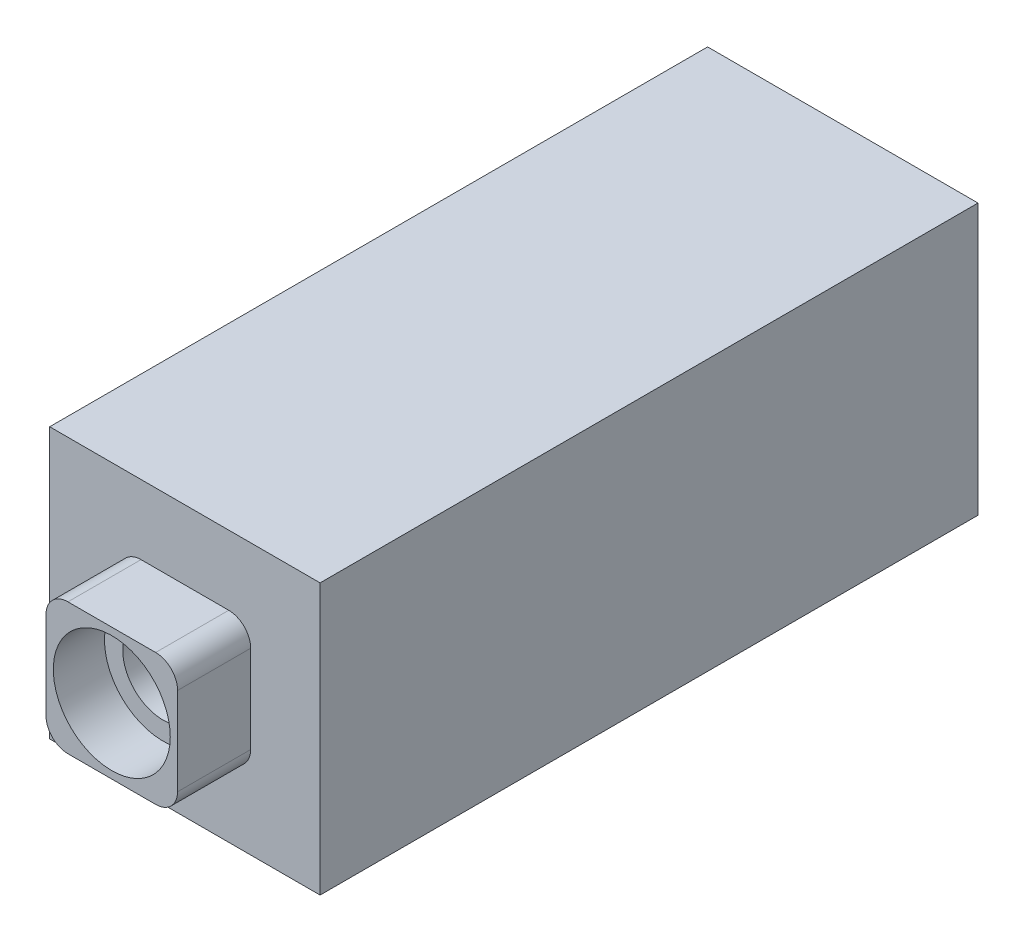
ISO-10303-21;
HEADER;
FILE_DESCRIPTION(('STEP AP214'),'2;1');
FILE_NAME('part.step','',(''),(''),'','','');
FILE_SCHEMA(('AUTOMOTIVE_DESIGN { 1 0 10303 214 1 1 1 1 }'));
ENDSEC;
DATA;
#1=APPLICATION_CONTEXT('core data for automotive mechanical design processes');
#2=APPLICATION_PROTOCOL_DEFINITION('international standard','automotive_design',2000,#1);
#3=PRODUCT_CONTEXT('',#1,'mechanical');
#4=PRODUCT('Part','Part','',(#3));
#5=PRODUCT_RELATED_PRODUCT_CATEGORY('part','',(#4));
#6=PRODUCT_DEFINITION_FORMATION('','',#4);
#7=PRODUCT_DEFINITION_CONTEXT('part definition',#1,'design');
#8=PRODUCT_DEFINITION('design','',#6,#7);
#9=PRODUCT_DEFINITION_SHAPE('','',#8);
#10=(LENGTH_UNIT() NAMED_UNIT(*) SI_UNIT(.MILLI.,.METRE.));
#11=(NAMED_UNIT(*) PLANE_ANGLE_UNIT() SI_UNIT($,.RADIAN.));
#12=(NAMED_UNIT(*) SI_UNIT($,.STERADIAN.) SOLID_ANGLE_UNIT());
#13=UNCERTAINTY_MEASURE_WITH_UNIT(LENGTH_MEASURE(1.E-05),#10,'distance_accuracy_value','');
#14=(GEOMETRIC_REPRESENTATION_CONTEXT(3) GLOBAL_UNCERTAINTY_ASSIGNED_CONTEXT((#13)) GLOBAL_UNIT_ASSIGNED_CONTEXT((#10,
#11,#12)) REPRESENTATION_CONTEXT('',''));
#15=CARTESIAN_POINT('',(0.,0.,0.));
#16=DIRECTION('',(0.,0.,1.));
#17=DIRECTION('',(1.,0.,0.));
#18=AXIS2_PLACEMENT_3D('',#15,#16,#17);
#19=CARTESIAN_POINT('',(0.,0.,-10.));
#20=DIRECTION('',(1.,0.,0.));
#21=DIRECTION('',(0.,1.,0.));
#22=AXIS2_PLACEMENT_3D('',#19,#20,#21);
#23=PLANE('',#22);
#24=DIRECTION('',(0.,1.,0.));
#25=VECTOR('',#24,1.);
#26=CARTESIAN_POINT('',(0.,0.,0.));
#27=LINE('',#26,#25);
#28=CARTESIAN_POINT('',(0.,-15.,0.));
#29=VERTEX_POINT('',#28);
#30=CARTESIAN_POINT('',(0.,-3.,0.));
#31=VERTEX_POINT('',#30);
#32=EDGE_CURVE('E229',#29,#31,#27,.T.);
#33=ORIENTED_EDGE('',*,*,#32,.F.);
#34=DIRECTION('',(0.,0.,1.));
#35=VECTOR('',#34,1.);
#36=CARTESIAN_POINT('',(0.,-15.,-10.));
#37=LINE('',#36,#35);
#38=CARTESIAN_POINT('',(0.,-15.,-10.));
#39=VERTEX_POINT('',#38);
#40=EDGE_CURVE('E49',#29,#39,#37,.F.);
#41=ORIENTED_EDGE('',*,*,#40,.T.);
#42=DIRECTION('',(0.,1.,0.));
#43=VECTOR('',#42,1.);
#44=CARTESIAN_POINT('',(0.,0.,-10.));
#45=LINE('',#44,#43);
#46=CARTESIAN_POINT('',(0.,-3.,-10.));
#47=VERTEX_POINT('',#46);
#48=EDGE_CURVE('E279',#39,#47,#45,.T.);
#49=ORIENTED_EDGE('',*,*,#48,.T.);
#50=DIRECTION('',(0.,0.,1.));
#51=VECTOR('',#50,1.);
#52=CARTESIAN_POINT('',(0.,-3.,-10.));
#53=LINE('',#52,#51);
#54=EDGE_CURVE('E332',#47,#31,#53,.T.);
#55=ORIENTED_EDGE('',*,*,#54,.T.);
#56=EDGE_LOOP('',(#33,#41,#49,#55));
#57=FACE_BOUND('',#56,.T.);
#58=ADVANCED_FACE('F40',(#57),#23,.T.);
#59=CARTESIAN_POINT('',(0.,-18.,-10.));
#60=DIRECTION('',(0.,-1.,0.));
#61=DIRECTION('',(1.,0.,0.));
#62=AXIS2_PLACEMENT_3D('',#59,#60,#61);
#63=PLANE('',#62);
#64=DIRECTION('',(1.,0.,0.));
#65=VECTOR('',#64,1.);
#66=CARTESIAN_POINT('',(0.,-18.,-10.));
#67=LINE('',#66,#65);
#68=CARTESIAN_POINT('',(-15.,-18.,-10.));
#69=VERTEX_POINT('',#68);
#70=CARTESIAN_POINT('',(-3.,-18.,-10.));
#71=VERTEX_POINT('',#70);
#72=EDGE_CURVE('E290',#69,#71,#67,.T.);
#73=ORIENTED_EDGE('',*,*,#72,.T.);
#74=DIRECTION('',(0.,0.,1.));
#75=VECTOR('',#74,1.);
#76=CARTESIAN_POINT('',(-3.,-18.,-10.));
#77=LINE('',#76,#75);
#78=CARTESIAN_POINT('',(-3.,-18.,0.));
#79=VERTEX_POINT('',#78);
#80=EDGE_CURVE('E346',#71,#79,#77,.T.);
#81=ORIENTED_EDGE('',*,*,#80,.T.);
#82=DIRECTION('',(1.,0.,0.));
#83=VECTOR('',#82,1.);
#84=CARTESIAN_POINT('',(0.,-18.,0.));
#85=LINE('',#84,#83);
#86=CARTESIAN_POINT('',(-15.,-18.,0.));
#87=VERTEX_POINT('',#86);
#88=EDGE_CURVE('E283',#87,#79,#85,.T.);
#89=ORIENTED_EDGE('',*,*,#88,.F.);
#90=DIRECTION('',(0.,0.,1.));
#91=VECTOR('',#90,1.);
#92=CARTESIAN_POINT('',(-15.,-18.,-10.));
#93=LINE('',#92,#91);
#94=EDGE_CURVE('E326',#87,#69,#93,.F.);
#95=ORIENTED_EDGE('',*,*,#94,.T.);
#96=EDGE_LOOP('',(#73,#81,#89,#95));
#97=FACE_BOUND('',#96,.T.);
#98=ADVANCED_FACE('F355',(#97),#63,.T.);
#99=CARTESIAN_POINT('',(-18.,0.,-10.));
#100=DIRECTION('',(-1.,0.,0.));
#101=DIRECTION('',(0.,-1.,0.));
#102=AXIS2_PLACEMENT_3D('',#99,#100,#101);
#103=PLANE('',#102);
#104=DIRECTION('',(0.,-1.,0.));
#105=VECTOR('',#104,1.);
#106=CARTESIAN_POINT('',(-18.,0.,-10.));
#107=LINE('',#106,#105);
#108=CARTESIAN_POINT('',(-18.,-3.,-10.));
#109=VERTEX_POINT('',#108);
#110=CARTESIAN_POINT('',(-18.,-15.,-10.));
#111=VERTEX_POINT('',#110);
#112=EDGE_CURVE('E286',#109,#111,#107,.T.);
#113=ORIENTED_EDGE('',*,*,#112,.T.);
#114=DIRECTION('',(0.,0.,1.));
#115=VECTOR('',#114,1.);
#116=CARTESIAN_POINT('',(-18.,-15.,-10.));
#117=LINE('',#116,#115);
#118=CARTESIAN_POINT('',(-18.,-15.,0.));
#119=VERTEX_POINT('',#118);
#120=EDGE_CURVE('E319',#111,#119,#117,.T.);
#121=ORIENTED_EDGE('',*,*,#120,.T.);
#122=DIRECTION('',(0.,-1.,0.));
#123=VECTOR('',#122,1.);
#124=CARTESIAN_POINT('',(-18.,0.,0.));
#125=LINE('',#124,#123);
#126=CARTESIAN_POINT('',(-18.,-3.,0.));
#127=VERTEX_POINT('',#126);
#128=EDGE_CURVE('E300',#127,#119,#125,.T.);
#129=ORIENTED_EDGE('',*,*,#128,.F.);
#130=DIRECTION('',(0.,0.,1.));
#131=VECTOR('',#130,1.);
#132=CARTESIAN_POINT('',(-18.,-3.,-10.));
#133=LINE('',#132,#131);
#134=EDGE_CURVE('E312',#127,#109,#133,.F.);
#135=ORIENTED_EDGE('',*,*,#134,.T.);
#136=EDGE_LOOP('',(#113,#121,#129,#135));
#137=FACE_BOUND('',#136,.T.);
#138=ADVANCED_FACE('F367',(#137),#103,.T.);
#139=CARTESIAN_POINT('',(0.,0.,-10.));
#140=DIRECTION('',(0.,1.,0.));
#141=DIRECTION('',(-1.,0.,0.));
#142=AXIS2_PLACEMENT_3D('',#139,#140,#141);
#143=PLANE('',#142);
#144=DIRECTION('',(-1.,0.,0.));
#145=VECTOR('',#144,1.);
#146=CARTESIAN_POINT('',(0.,0.,0.));
#147=LINE('',#146,#145);
#148=CARTESIAN_POINT('',(-3.,0.,0.));
#149=VERTEX_POINT('',#148);
#150=CARTESIAN_POINT('',(-15.,0.,0.));
#151=VERTEX_POINT('',#150);
#152=EDGE_CURVE('E297',#149,#151,#147,.T.);
#153=ORIENTED_EDGE('',*,*,#152,.F.);
#154=DIRECTION('',(0.,0.,1.));
#155=VECTOR('',#154,1.);
#156=CARTESIAN_POINT('',(-3.,0.,-10.));
#157=LINE('',#156,#155);
#158=CARTESIAN_POINT('',(-3.,0.,-10.));
#159=VERTEX_POINT('',#158);
#160=EDGE_CURVE('E339',#149,#159,#157,.F.);
#161=ORIENTED_EDGE('',*,*,#160,.T.);
#162=DIRECTION('',(-1.,0.,0.));
#163=VECTOR('',#162,1.);
#164=CARTESIAN_POINT('',(0.,0.,-10.));
#165=LINE('',#164,#163);
#166=CARTESIAN_POINT('',(-15.,0.,-10.));
#167=VERTEX_POINT('',#166);
#168=EDGE_CURVE('E282',#159,#167,#165,.T.);
#169=ORIENTED_EDGE('',*,*,#168,.T.);
#170=DIRECTION('',(0.,0.,1.));
#171=VECTOR('',#170,1.);
#172=CARTESIAN_POINT('',(-15.,0.,-10.));
#173=LINE('',#172,#171);
#174=EDGE_CURVE('E294',#167,#151,#173,.T.);
#175=ORIENTED_EDGE('',*,*,#174,.T.);
#176=EDGE_LOOP('',(#153,#161,#169,#175));
#177=FACE_BOUND('',#176,.T.);
#178=ADVANCED_FACE('F380',(#177),#143,.T.);
#179=CARTESIAN_POINT('',(0.,0.,0.));
#180=DIRECTION('',(0.,0.,-1.));
#181=DIRECTION('',(-1.,0.,0.));
#182=AXIS2_PLACEMENT_3D('',#179,#180,#181);
#183=PLANE('',#182);
#184=CARTESIAN_POINT('',(-9.,-9.,0.));
#185=DIRECTION('',(0.,0.,1.));
#186=DIRECTION('',(1.,0.,0.));
#187=AXIS2_PLACEMENT_3D('',#184,#185,#186);
#188=CIRCLE('',#187,8.);
#189=CARTESIAN_POINT('',(-0.999999999999997,-9.,0.));
#190=VERTEX_POINT('',#189);
#191=EDGE_CURVE('E584',#190,#190,#188,.T.);
#192=ORIENTED_EDGE('',*,*,#191,.F.);
#193=EDGE_LOOP('',(#192));
#194=FACE_BOUND('',#193,.T.);
#195=ORIENTED_EDGE('',*,*,#88,.T.);
#196=CARTESIAN_POINT('',(-3.,-15.,0.));
#197=DIRECTION('',(0.,0.,-1.));
#198=DIRECTION('',(-1.,0.,0.));
#199=AXIS2_PLACEMENT_3D('',#196,#197,#198);
#200=CIRCLE('',#199,3.);
#201=EDGE_CURVE('E63',#79,#29,#200,.F.);
#202=ORIENTED_EDGE('',*,*,#201,.T.);
#203=ORIENTED_EDGE('',*,*,#32,.T.);
#204=CARTESIAN_POINT('',(-3.,-3.,0.));
#205=DIRECTION('',(0.,0.,-1.));
#206=DIRECTION('',(-1.,0.,0.));
#207=AXIS2_PLACEMENT_3D('',#204,#205,#206);
#208=CIRCLE('',#207,3.);
#209=EDGE_CURVE('E336',#31,#149,#208,.F.);
#210=ORIENTED_EDGE('',*,*,#209,.T.);
#211=ORIENTED_EDGE('',*,*,#152,.T.);
#212=CARTESIAN_POINT('',(-15.,-3.,0.));
#213=DIRECTION('',(0.,0.,-1.));
#214=DIRECTION('',(-1.,0.,0.));
#215=AXIS2_PLACEMENT_3D('',#212,#213,#214);
#216=CIRCLE('',#215,3.);
#217=EDGE_CURVE('E309',#151,#127,#216,.F.);
#218=ORIENTED_EDGE('',*,*,#217,.T.);
#219=ORIENTED_EDGE('',*,*,#128,.T.);
#220=CARTESIAN_POINT('',(-15.,-15.,0.));
#221=DIRECTION('',(0.,0.,-1.));
#222=DIRECTION('',(-1.,0.,0.));
#223=AXIS2_PLACEMENT_3D('',#220,#221,#222);
#224=CIRCLE('',#223,3.);
#225=EDGE_CURVE('E323',#119,#87,#224,.F.);
#226=ORIENTED_EDGE('',*,*,#225,.T.);
#227=EDGE_LOOP('',(#195,#202,#203,#210,#211,#218,#219,#226));
#228=FACE_BOUND('',#227,.T.);
#229=ADVANCED_FACE('F360',(#194,#228),#183,.F.);
#230=CARTESIAN_POINT('',(1.35371699026303E-11,-3.46777276140157E-13,-9.99999999997528));
#231=DIRECTION('',(-1.35371699026638E-12,0.,1.));
#232=DIRECTION('',(1.,0.,1.35371699026638E-12));
#233=AXIS2_PLACEMENT_3D('',#230,#231,#232);
#234=PLANE('',#233);
#235=DIRECTION('',(0.,1.,0.));
#236=VECTOR('',#235,1.);
#237=CARTESIAN_POINT('',(9.49559288946557,-27.4955928894656,-9.99999999997432));
#238=LINE('',#237,#236);
#239=CARTESIAN_POINT('',(9.49559288946557,-27.4955928894656,-9.99999999997432));
#240=VERTEX_POINT('',#239);
#241=CARTESIAN_POINT('',(9.49559288946557,9.49559288946557,-9.99999999997432));
#242=VERTEX_POINT('',#241);
#243=EDGE_CURVE('E216',#240,#242,#238,.T.);
#244=ORIENTED_EDGE('',*,*,#243,.T.);
#245=DIRECTION('',(-1.,0.,-1.38839083279729E-12));
#246=VECTOR('',#245,1.);
#247=CARTESIAN_POINT('',(9.49559288946557,9.49559288946557,-9.99999999997432));
#248=LINE('',#247,#246);
#249=CARTESIAN_POINT('',(-27.4955928894656,9.49559288946558,-10.0000000000257));
#250=VERTEX_POINT('',#249);
#251=EDGE_CURVE('E225',#242,#250,#248,.T.);
#252=ORIENTED_EDGE('',*,*,#251,.T.);
#253=DIRECTION('',(0.,1.,0.));
#254=VECTOR('',#253,1.);
#255=CARTESIAN_POINT('',(-27.4955928894656,-27.4955928894656,-10.0000000000257));
#256=LINE('',#255,#254);
#257=CARTESIAN_POINT('',(-27.4955928894656,-27.4955928894656,-10.0000000000257));
#258=VERTEX_POINT('',#257);
#259=EDGE_CURVE('E233',#258,#250,#256,.T.);
#260=ORIENTED_EDGE('',*,*,#259,.F.);
#261=DIRECTION('',(-1.,0.,-1.38839083279729E-12));
#262=VECTOR('',#261,1.);
#263=CARTESIAN_POINT('',(9.49559288946557,-27.4955928894656,-9.99999999997432));
#264=LINE('',#263,#262);
#265=EDGE_CURVE('E259',#240,#258,#264,.T.);
#266=ORIENTED_EDGE('',*,*,#265,.F.);
#267=EDGE_LOOP('',(#244,#252,#260,#266));
#268=FACE_BOUND('',#267,.T.);
#269=ORIENTED_EDGE('',*,*,#48,.F.);
#270=CARTESIAN_POINT('',(-3.,-15.,-9.99999999997882));
#271=DIRECTION('',(-1.35371699026638E-12,0.,1.));
#272=DIRECTION('',(1.,0.,1.35371699026638E-12));
#273=AXIS2_PLACEMENT_3D('',#270,#271,#272);
#274=CIRCLE('',#273,3.);
#275=EDGE_CURVE('E12',#39,#71,#274,.F.);
#276=ORIENTED_EDGE('',*,*,#275,.T.);
#277=ORIENTED_EDGE('',*,*,#72,.F.);
#278=CARTESIAN_POINT('',(-15.,-15.,-9.99999999999507));
#279=DIRECTION('',(-1.35371699026638E-12,0.,1.));
#280=DIRECTION('',(1.,0.,1.35371699026638E-12));
#281=AXIS2_PLACEMENT_3D('',#278,#279,#280);
#282=CIRCLE('',#281,3.);
#283=EDGE_CURVE('E329',#69,#111,#282,.F.);
#284=ORIENTED_EDGE('',*,*,#283,.T.);
#285=ORIENTED_EDGE('',*,*,#112,.F.);
#286=CARTESIAN_POINT('',(-15.,-3.,-9.99999999999548));
#287=DIRECTION('',(-1.35371699026638E-12,0.,1.));
#288=DIRECTION('',(1.,0.,1.35371699026638E-12));
#289=AXIS2_PLACEMENT_3D('',#286,#287,#288);
#290=CIRCLE('',#289,3.);
#291=EDGE_CURVE('E315',#109,#167,#290,.F.);
#292=ORIENTED_EDGE('',*,*,#291,.T.);
#293=ORIENTED_EDGE('',*,*,#168,.F.);
#294=CARTESIAN_POINT('',(-3.,-3.,-9.99999999997924));
#295=DIRECTION('',(-1.35371699026638E-12,0.,1.));
#296=DIRECTION('',(1.,0.,1.35371699026638E-12));
#297=AXIS2_PLACEMENT_3D('',#294,#295,#296);
#298=CIRCLE('',#297,3.);
#299=EDGE_CURVE('E342',#159,#47,#298,.F.);
#300=ORIENTED_EDGE('',*,*,#299,.T.);
#301=EDGE_LOOP('',(#269,#276,#277,#284,#285,#292,#293,#300));
#302=FACE_BOUND('',#301,.T.);
#303=ADVANCED_FACE('F372',(#268,#302),#234,.T.);
#304=CARTESIAN_POINT('',(1.35371699026303E-11,-3.46777276140157E-13,-99.9999999999753));
#305=DIRECTION('',(-1.35371699026638E-12,0.,1.));
#306=DIRECTION('',(1.,0.,1.35371699026638E-12));
#307=AXIS2_PLACEMENT_3D('',#304,#305,#306);
#308=PLANE('',#307);
#309=CARTESIAN_POINT('',(-9.,-9.,-100.));
#310=DIRECTION('',(0.,0.,1.));
#311=DIRECTION('',(1.,0.,0.));
#312=AXIS2_PLACEMENT_3D('',#309,#310,#311);
#313=CIRCLE('',#312,5.5);
#314=CARTESIAN_POINT('',(-3.5,-9.,-100.));
#315=VERTEX_POINT('',#314);
#316=EDGE_CURVE('E196',#315,#315,#313,.T.);
#317=ORIENTED_EDGE('',*,*,#316,.T.);
#318=EDGE_LOOP('',(#317));
#319=FACE_BOUND('',#318,.T.);
#320=CARTESIAN_POINT('',(-9.,-9.,-99.9999999999871));
#321=DIRECTION('',(1.35371699026638E-12,0.,-1.));
#322=DIRECTION('',(-1.,0.,-1.35371699026638E-12));
#323=AXIS2_PLACEMENT_3D('',#320,#321,#322);
#324=CIRCLE('',#323,16.4198589336583);
#325=CARTESIAN_POINT('',(-20.6105935981163,-20.6105935981163,-100.000000000002));
#326=VERTEX_POINT('',#325);
#327=CARTESIAN_POINT('',(-12.7080843448296,-24.9956831017893,-99.9999999999916));
#328=VERTEX_POINT('',#327);
#329=EDGE_CURVE('E195',#326,#328,#324,.T.);
#330=ORIENTED_EDGE('',*,*,#329,.F.);
#331=CARTESIAN_POINT('',(-18.3478518983194,-18.3478518983194,-99.9999999999995));
#332=DIRECTION('',(1.35371699026638E-12,0.,-1.));
#333=DIRECTION('',(-1.,0.,-1.35371699026638E-12));
#334=AXIS2_PLACEMENT_3D('',#331,#332,#333);
#335=CIRCLE('',#334,3.2);
#336=CARTESIAN_POINT('',(-16.0851101985224,-16.0851101985224,-99.9999999999965));
#337=VERTEX_POINT('',#336);
#338=EDGE_CURVE('E159',#337,#326,#335,.T.);
#339=ORIENTED_EDGE('',*,*,#338,.F.);
#340=CARTESIAN_POINT('',(-9.,-9.,-99.9999999999871));
#341=DIRECTION('',(-1.35371699026638E-12,0.,1.));
#342=DIRECTION('',(-1.,0.,-1.35371699026638E-12));
#343=AXIS2_PLACEMENT_3D('',#340,#341,#342);
#344=CIRCLE('',#343,10.0198589336583);
#345=CARTESIAN_POINT('',(-11.2627771772837,-18.7610149316747,-99.9999999999899));
#346=VERTEX_POINT('',#345);
#347=EDGE_CURVE('E179',#346,#337,#344,.T.);
#348=ORIENTED_EDGE('',*,*,#347,.F.);
#349=CARTESIAN_POINT('',(-11.9854307610567,-21.878349016732,-99.9999999999907));
#350=DIRECTION('',(1.35371699026638E-12,0.,-1.));
#351=DIRECTION('',(-1.,0.,-1.35371699026638E-12));
#352=AXIS2_PLACEMENT_3D('',#349,#350,#351);
#353=CIRCLE('',#352,3.2);
#354=EDGE_CURVE('E183',#328,#346,#353,.T.);
#355=ORIENTED_EDGE('',*,*,#354,.F.);
#356=EDGE_LOOP('',(#330,#339,#348,#355));
#357=FACE_BOUND('',#356,.T.);
#358=DIRECTION('',(0.,1.,0.));
#359=VECTOR('',#358,1.);
#360=CARTESIAN_POINT('',(9.49559288946557,-27.4955928894656,-99.9999999999743));
#361=LINE('',#360,#359);
#362=CARTESIAN_POINT('',(9.49559288946557,-27.4955928894656,-99.9999999999743));
#363=VERTEX_POINT('',#362);
#364=CARTESIAN_POINT('',(9.49559288946557,9.49559288946558,-99.9999999999743));
#365=VERTEX_POINT('',#364);
#366=EDGE_CURVE('E205',#363,#365,#361,.T.);
#367=ORIENTED_EDGE('',*,*,#366,.F.);
#368=DIRECTION('',(-1.,0.,-1.38839083279729E-12));
#369=VECTOR('',#368,1.);
#370=CARTESIAN_POINT('',(9.49559288946557,-27.4955928894656,-99.9999999999743));
#371=LINE('',#370,#369);
#372=CARTESIAN_POINT('',(-27.4955928894656,-27.4955928894656,-100.000000000026));
#373=VERTEX_POINT('',#372);
#374=EDGE_CURVE('E215',#363,#373,#371,.T.);
#375=ORIENTED_EDGE('',*,*,#374,.T.);
#376=DIRECTION('',(0.,1.,0.));
#377=VECTOR('',#376,1.);
#378=CARTESIAN_POINT('',(-27.4955928894656,-27.4955928894656,-100.000000000026));
#379=LINE('',#378,#377);
#380=CARTESIAN_POINT('',(-27.4955928894656,9.49559288946557,-100.000000000026));
#381=VERTEX_POINT('',#380);
#382=EDGE_CURVE('E237',#373,#381,#379,.T.);
#383=ORIENTED_EDGE('',*,*,#382,.T.);
#384=DIRECTION('',(-1.,0.,-1.38839083279729E-12));
#385=VECTOR('',#384,1.);
#386=CARTESIAN_POINT('',(9.49559288946557,9.49559288946557,-99.9999999999743));
#387=LINE('',#386,#385);
#388=EDGE_CURVE('E230',#365,#381,#387,.T.);
#389=ORIENTED_EDGE('',*,*,#388,.F.);
#390=EDGE_LOOP('',(#367,#375,#383,#389));
#391=FACE_BOUND('',#390,.T.);
#392=ADVANCED_FACE('F444',(#319,#357,#391),#308,.F.);
#393=CARTESIAN_POINT('',(9.49559288946557,-27.4955928894656,-9.99999999997432));
#394=DIRECTION('',(-1.,0.,0.));
#395=DIRECTION('',(0.,0.,1.));
#396=AXIS2_PLACEMENT_3D('',#393,#394,#395);
#397=PLANE('',#396);
#398=ORIENTED_EDGE('',*,*,#366,.T.);
#399=DIRECTION('',(0.,0.,-1.));
#400=VECTOR('',#399,1.);
#401=CARTESIAN_POINT('',(9.49559288946557,9.49559288946557,-9.99999999997432));
#402=LINE('',#401,#400);
#403=EDGE_CURVE('E211',#242,#365,#402,.T.);
#404=ORIENTED_EDGE('',*,*,#403,.F.);
#405=ORIENTED_EDGE('',*,*,#243,.F.);
#406=DIRECTION('',(0.,0.,-1.));
#407=VECTOR('',#406,1.);
#408=CARTESIAN_POINT('',(9.49559288946557,-27.4955928894656,-9.99999999997432));
#409=LINE('',#408,#407);
#410=EDGE_CURVE('E222',#240,#363,#409,.T.);
#411=ORIENTED_EDGE('',*,*,#410,.T.);
#412=EDGE_LOOP('',(#398,#404,#405,#411));
#413=FACE_BOUND('',#412,.T.);
#414=ADVANCED_FACE('F455',(#413),#397,.F.);
#415=CARTESIAN_POINT('',(9.49559288946557,9.49559288946557,-9.99999999997432));
#416=DIRECTION('',(0.,-1.,0.));
#417=DIRECTION('',(0.,0.,-1.));
#418=AXIS2_PLACEMENT_3D('',#415,#416,#417);
#419=PLANE('',#418);
#420=ORIENTED_EDGE('',*,*,#388,.T.);
#421=DIRECTION('',(0.,0.,-1.));
#422=VECTOR('',#421,1.);
#423=CARTESIAN_POINT('',(-27.4955928894656,9.49559288946557,-10.0000000000257));
#424=LINE('',#423,#422);
#425=EDGE_CURVE('E236',#250,#381,#424,.T.);
#426=ORIENTED_EDGE('',*,*,#425,.F.);
#427=ORIENTED_EDGE('',*,*,#251,.F.);
#428=ORIENTED_EDGE('',*,*,#403,.T.);
#429=EDGE_LOOP('',(#420,#426,#427,#428));
#430=FACE_BOUND('',#429,.T.);
#431=ADVANCED_FACE('F467',(#430),#419,.F.);
#432=CARTESIAN_POINT('',(9.49559288946557,-27.4955928894656,-9.99999999997432));
#433=DIRECTION('',(0.,-1.,0.));
#434=DIRECTION('',(0.,0.,-1.));
#435=AXIS2_PLACEMENT_3D('',#432,#433,#434);
#436=PLANE('',#435);
#437=ORIENTED_EDGE('',*,*,#374,.F.);
#438=ORIENTED_EDGE('',*,*,#410,.F.);
#439=ORIENTED_EDGE('',*,*,#265,.T.);
#440=DIRECTION('',(0.,0.,-1.));
#441=VECTOR('',#440,1.);
#442=CARTESIAN_POINT('',(-27.4955928894656,-27.4955928894656,-10.0000000000257));
#443=LINE('',#442,#441);
#444=EDGE_CURVE('E256',#258,#373,#443,.T.);
#445=ORIENTED_EDGE('',*,*,#444,.T.);
#446=EDGE_LOOP('',(#437,#438,#439,#445));
#447=FACE_BOUND('',#446,.T.);
#448=ADVANCED_FACE('F474',(#447),#436,.T.);
#449=CARTESIAN_POINT('',(-27.4955928894656,-27.4955928894656,-10.0000000000257));
#450=DIRECTION('',(-1.,0.,0.));
#451=DIRECTION('',(0.,0.,1.));
#452=AXIS2_PLACEMENT_3D('',#449,#450,#451);
#453=PLANE('',#452);
#454=ORIENTED_EDGE('',*,*,#382,.F.);
#455=ORIENTED_EDGE('',*,*,#444,.F.);
#456=ORIENTED_EDGE('',*,*,#259,.T.);
#457=ORIENTED_EDGE('',*,*,#425,.T.);
#458=EDGE_LOOP('',(#454,#455,#456,#457));
#459=FACE_BOUND('',#458,.T.);
#460=ADVANCED_FACE('F447',(#459),#453,.T.);
#461=CARTESIAN_POINT('',(-18.3478518984358,-18.3478518983164,-13.9999999999995));
#462=DIRECTION('',(1.35371699026638E-12,0.,-1.));
#463=DIRECTION('',(-1.,0.,-1.35371699026638E-12));
#464=AXIS2_PLACEMENT_3D('',#461,#462,#463);
#465=CYLINDRICAL_SURFACE('',#464,3.2);
#466=ORIENTED_EDGE('',*,*,#338,.T.);
#467=DIRECTION('',(1.35371699026638E-12,0.,-1.));
#468=VECTOR('',#467,1.);
#469=CARTESIAN_POINT('',(-20.6105935982327,-20.6105935981133,-14.0000000000025));
#470=LINE('',#469,#468);
#471=CARTESIAN_POINT('',(-20.6105935982327,-20.6105935981133,-14.0000000000025));
#472=VERTEX_POINT('',#471);
#473=EDGE_CURVE('E152',#472,#326,#470,.T.);
#474=ORIENTED_EDGE('',*,*,#473,.F.);
#475=CARTESIAN_POINT('',(-18.3478518984358,-18.3478518983164,-13.9999999999995));
#476=DIRECTION('',(1.35371699026638E-12,0.,-1.));
#477=DIRECTION('',(-1.,0.,-1.35371699026638E-12));
#478=AXIS2_PLACEMENT_3D('',#475,#476,#477);
#479=CIRCLE('',#478,3.2);
#480=CARTESIAN_POINT('',(-16.0851101986388,-16.0851101985194,-13.9999999999965));
#481=VERTEX_POINT('',#480);
#482=EDGE_CURVE('E156',#481,#472,#479,.T.);
#483=ORIENTED_EDGE('',*,*,#482,.F.);
#484=DIRECTION('',(1.35371699026638E-12,0.,-1.));
#485=VECTOR('',#484,1.);
#486=CARTESIAN_POINT('',(-16.0851101986388,-16.0851101985194,-13.9999999999965));
#487=LINE('',#486,#485);
#488=EDGE_CURVE('E202',#481,#337,#487,.T.);
#489=ORIENTED_EDGE('',*,*,#488,.T.);
#490=EDGE_LOOP('',(#466,#474,#483,#489));
#491=FACE_BOUND('',#490,.T.);
#492=ADVANCED_FACE('F154',(#491),#465,.F.);
#493=CARTESIAN_POINT('',(-9.00000000011642,-8.99999999999702,-13.9999999999871));
#494=DIRECTION('',(1.35371699026638E-12,0.,-1.));
#495=DIRECTION('',(-1.,0.,-1.35371699026638E-12));
#496=AXIS2_PLACEMENT_3D('',#493,#494,#495);
#497=CYLINDRICAL_SURFACE('',#496,10.0198589336583);
#498=ORIENTED_EDGE('',*,*,#347,.T.);
#499=ORIENTED_EDGE('',*,*,#488,.F.);
#500=CARTESIAN_POINT('',(-9.00000000011642,-8.99999999999702,-13.9999999999871));
#501=DIRECTION('',(-1.35371699026638E-12,0.,1.));
#502=DIRECTION('',(-1.,0.,-1.35371699026638E-12));
#503=AXIS2_PLACEMENT_3D('',#500,#501,#502);
#504=CIRCLE('',#503,10.0198589336583);
#505=CARTESIAN_POINT('',(-11.2627771774001,-18.7610149316717,-13.9999999999899));
#506=VERTEX_POINT('',#505);
#507=EDGE_CURVE('E165',#506,#481,#504,.T.);
#508=ORIENTED_EDGE('',*,*,#507,.F.);
#509=DIRECTION('',(1.35371699026638E-12,0.,-1.));
#510=VECTOR('',#509,1.);
#511=CARTESIAN_POINT('',(-11.2627771774001,-18.7610149316717,-13.9999999999899));
#512=LINE('',#511,#510);
#513=EDGE_CURVE('E206',#506,#346,#512,.T.);
#514=ORIENTED_EDGE('',*,*,#513,.T.);
#515=EDGE_LOOP('',(#498,#499,#508,#514));
#516=FACE_BOUND('',#515,.T.);
#517=ADVANCED_FACE('F496',(#516),#497,.T.);
#518=CARTESIAN_POINT('',(-11.9854307611731,-21.878349016729,-13.9999999999907));
#519=DIRECTION('',(1.35371699026638E-12,0.,-1.));
#520=DIRECTION('',(-1.,0.,-1.35371699026638E-12));
#521=AXIS2_PLACEMENT_3D('',#518,#519,#520);
#522=CYLINDRICAL_SURFACE('',#521,3.2);
#523=ORIENTED_EDGE('',*,*,#354,.T.);
#524=ORIENTED_EDGE('',*,*,#513,.F.);
#525=CARTESIAN_POINT('',(-11.9854307611731,-21.878349016729,-13.9999999999907));
#526=DIRECTION('',(1.35371699026638E-12,0.,-1.));
#527=DIRECTION('',(-1.,0.,-1.35371699026638E-12));
#528=AXIS2_PLACEMENT_3D('',#525,#526,#527);
#529=CIRCLE('',#528,3.2);
#530=CARTESIAN_POINT('',(-12.7080843449461,-24.9956831017864,-13.9999999999916));
#531=VERTEX_POINT('',#530);
#532=EDGE_CURVE('E174',#531,#506,#529,.T.);
#533=ORIENTED_EDGE('',*,*,#532,.F.);
#534=DIRECTION('',(1.35371699026638E-12,0.,-1.));
#535=VECTOR('',#534,1.);
#536=CARTESIAN_POINT('',(-12.7080843449461,-24.9956831017864,-13.9999999999916));
#537=LINE('',#536,#535);
#538=EDGE_CURVE('E164',#531,#328,#537,.T.);
#539=ORIENTED_EDGE('',*,*,#538,.T.);
#540=EDGE_LOOP('',(#523,#524,#533,#539));
#541=FACE_BOUND('',#540,.T.);
#542=ADVANCED_FACE('F503',(#541),#522,.F.);
#543=CARTESIAN_POINT('',(-9.00000000011642,-8.99999999999702,-13.9999999999871));
#544=DIRECTION('',(1.35371699026638E-12,0.,-1.));
#545=DIRECTION('',(-1.,0.,-1.35371699026638E-12));
#546=AXIS2_PLACEMENT_3D('',#543,#544,#545);
#547=CYLINDRICAL_SURFACE('',#546,16.4198589336583);
#548=ORIENTED_EDGE('',*,*,#329,.T.);
#549=ORIENTED_EDGE('',*,*,#538,.F.);
#550=CARTESIAN_POINT('',(-9.00000000011642,-8.99999999999702,-13.9999999999871));
#551=DIRECTION('',(1.35371699026638E-12,0.,-1.));
#552=DIRECTION('',(-1.,0.,-1.35371699026638E-12));
#553=AXIS2_PLACEMENT_3D('',#550,#551,#552);
#554=CIRCLE('',#553,16.4198589336583);
#555=EDGE_CURVE('E168',#472,#531,#554,.T.);
#556=ORIENTED_EDGE('',*,*,#555,.F.);
#557=ORIENTED_EDGE('',*,*,#473,.T.);
#558=EDGE_LOOP('',(#548,#549,#556,#557));
#559=FACE_BOUND('',#558,.T.);
#560=ADVANCED_FACE('F169',(#559),#547,.F.);
#561=CARTESIAN_POINT('',(-13.6739259492761,-13.6739259491567,-13.9999999999933));
#562=DIRECTION('',(1.35371699026638E-12,0.,-1.));
#563=DIRECTION('',(-1.,0.,-1.35371699026638E-12));
#564=AXIS2_PLACEMENT_3D('',#561,#562,#563);
#565=PLANE('',#564);
#566=ORIENTED_EDGE('',*,*,#482,.T.);
#567=ORIENTED_EDGE('',*,*,#555,.T.);
#568=ORIENTED_EDGE('',*,*,#532,.T.);
#569=ORIENTED_EDGE('',*,*,#507,.T.);
#570=EDGE_LOOP('',(#566,#567,#568,#569));
#571=FACE_BOUND('',#570,.T.);
#572=ADVANCED_FACE('F176',(#571),#565,.T.);
#573=CARTESIAN_POINT('',(-9.,-9.,-100.));
#574=DIRECTION('',(0.,0.,1.));
#575=DIRECTION('',(1.,0.,0.));
#576=AXIS2_PLACEMENT_3D('',#573,#574,#575);
#577=CYLINDRICAL_SURFACE('',#576,5.5);
#578=CARTESIAN_POINT('',(-9.,-9.,-6.99999999999999));
#579=DIRECTION('',(0.,0.,1.));
#580=DIRECTION('',(1.,0.,0.));
#581=AXIS2_PLACEMENT_3D('',#578,#579,#580);
#582=CIRCLE('',#581,5.5);
#583=CARTESIAN_POINT('',(-3.5,-9.,-7.00000000000001));
#584=VERTEX_POINT('',#583);
#585=EDGE_CURVE('E186',#584,#584,#582,.T.);
#586=CARTESIAN_POINT('',(-3.5,-9.,-100.));
#587=CARTESIAN_POINT('',(-3.5,-9.,-99.03125));
#588=CARTESIAN_POINT('',(-3.5,-9.,-98.0625));
#589=CARTESIAN_POINT('',(-3.5,-9.,-96.125));
#590=CARTESIAN_POINT('',(-3.5,-9.,-95.15625));
#591=CARTESIAN_POINT('',(-3.5,-9.,-93.21875));
#592=CARTESIAN_POINT('',(-3.5,-9.,-92.25));
#593=CARTESIAN_POINT('',(-3.5,-9.,-90.3125));
#594=CARTESIAN_POINT('',(-3.5,-9.,-89.34375));
#595=CARTESIAN_POINT('',(-3.5,-9.,-87.40625));
#596=CARTESIAN_POINT('',(-3.5,-9.,-86.4375));
#597=CARTESIAN_POINT('',(-3.5,-9.,-84.5));
#598=CARTESIAN_POINT('',(-3.5,-9.,-83.53125));
#599=CARTESIAN_POINT('',(-3.5,-9.,-81.59375));
#600=CARTESIAN_POINT('',(-3.5,-9.,-80.625));
#601=CARTESIAN_POINT('',(-3.5,-9.,-78.6875));
#602=CARTESIAN_POINT('',(-3.5,-9.,-77.71875));
#603=CARTESIAN_POINT('',(-3.5,-9.,-75.78125));
#604=CARTESIAN_POINT('',(-3.5,-9.,-74.8125));
#605=CARTESIAN_POINT('',(-3.5,-9.,-72.875));
#606=CARTESIAN_POINT('',(-3.5,-9.,-71.90625));
#607=CARTESIAN_POINT('',(-3.5,-9.,-69.96875));
#608=CARTESIAN_POINT('',(-3.5,-9.,-69.));
#609=CARTESIAN_POINT('',(-3.5,-9.,-67.0625));
#610=CARTESIAN_POINT('',(-3.5,-9.,-66.09375));
#611=CARTESIAN_POINT('',(-3.5,-9.,-64.15625));
#612=CARTESIAN_POINT('',(-3.5,-9.,-63.1875));
#613=CARTESIAN_POINT('',(-3.5,-9.,-61.25));
#614=CARTESIAN_POINT('',(-3.5,-9.,-60.28125));
#615=CARTESIAN_POINT('',(-3.5,-9.,-58.34375));
#616=CARTESIAN_POINT('',(-3.5,-9.,-57.375));
#617=CARTESIAN_POINT('',(-3.5,-9.,-55.4375));
#618=CARTESIAN_POINT('',(-3.5,-9.,-54.46875));
#619=CARTESIAN_POINT('',(-3.5,-9.,-52.53125));
#620=CARTESIAN_POINT('',(-3.5,-9.,-51.5625));
#621=CARTESIAN_POINT('',(-3.5,-9.,-49.625));
#622=CARTESIAN_POINT('',(-3.5,-9.,-48.65625));
#623=CARTESIAN_POINT('',(-3.5,-9.,-46.71875));
#624=CARTESIAN_POINT('',(-3.5,-9.,-45.75));
#625=CARTESIAN_POINT('',(-3.5,-9.,-43.8125));
#626=CARTESIAN_POINT('',(-3.5,-9.,-42.84375));
#627=CARTESIAN_POINT('',(-3.5,-9.,-40.90625));
#628=CARTESIAN_POINT('',(-3.5,-9.,-39.9375));
#629=CARTESIAN_POINT('',(-3.5,-9.,-38.));
#630=CARTESIAN_POINT('',(-3.5,-9.,-37.03125));
#631=CARTESIAN_POINT('',(-3.5,-9.,-35.09375));
#632=CARTESIAN_POINT('',(-3.5,-9.,-34.125));
#633=CARTESIAN_POINT('',(-3.5,-9.,-32.1875));
#634=CARTESIAN_POINT('',(-3.5,-9.,-31.21875));
#635=CARTESIAN_POINT('',(-3.5,-9.,-29.28125));
#636=CARTESIAN_POINT('',(-3.5,-9.,-28.3125));
#637=CARTESIAN_POINT('',(-3.5,-9.,-26.375));
#638=CARTESIAN_POINT('',(-3.5,-9.,-25.40625));
#639=CARTESIAN_POINT('',(-3.5,-9.,-23.46875));
#640=CARTESIAN_POINT('',(-3.5,-9.,-22.5));
#641=CARTESIAN_POINT('',(-3.5,-9.,-20.5625));
#642=CARTESIAN_POINT('',(-3.5,-9.,-19.59375));
#643=CARTESIAN_POINT('',(-3.5,-9.,-17.65625));
#644=CARTESIAN_POINT('',(-3.5,-9.,-16.6875));
#645=CARTESIAN_POINT('',(-3.5,-9.,-14.75));
#646=CARTESIAN_POINT('',(-3.5,-9.,-13.78125));
#647=CARTESIAN_POINT('',(-3.5,-9.,-11.84375));
#648=CARTESIAN_POINT('',(-3.5,-9.,-10.875));
#649=CARTESIAN_POINT('',(-3.5,-9.,-8.93750000000001));
#650=CARTESIAN_POINT('',(-3.5,-9.,-7.96875000000001));
#651=CARTESIAN_POINT('',(-3.5,-9.,-7.00000000000001));
#652=B_SPLINE_CURVE_WITH_KNOTS('',3,(#586,#587,#588,#589,#590,#591,#592,#593,#594,#595,#596,
#597,#598,#599,#600,#601,#602,#603,#604,#605,#606,#607,#608,#609,#610,#611,#612,#613,#614,#615,
#616,#617,#618,#619,#620,#621,#622,#623,#624,#625,#626,#627,#628,#629,#630,#631,#632,#633,#634,
#635,#636,#637,#638,#639,#640,#641,#642,#643,#644,#645,#646,#647,#648,#649,#650,#651),
.UNSPECIFIED.,.F.,.F.,(4,2,2,2,2,2,2,2,2,2,2,2,2,2,2,2,2,2,2,2,2,2,2,2,2,2,2,2,2,2,2,2,4),(0.,
2.90625,5.8125,8.71875,11.625,14.53125,17.4375,20.34375,23.25,26.15625,29.0625,31.96875,34.875,
37.78125,40.6875,43.59375,46.5,49.40625,52.3125,55.21875,58.125,61.03125,63.9375,66.84375,69.75,
72.65625,75.5625,78.46875,81.375,84.28125,87.1875,90.09375,93.),.UNSPECIFIED.);
#653=EDGE_CURVE('BSEAM523',#315,#584,#652,.T.);
#654=ORIENTED_EDGE('',*,*,#316,.F.);
#655=ORIENTED_EDGE('',*,*,#585,.T.);
#656=ORIENTED_EDGE('',*,*,#653,.T.);
#657=ORIENTED_EDGE('',*,*,#653,.F.);
#658=EDGE_LOOP('',(#654,#656,#655,#657));
#659=FACE_BOUND('',#658,.T.);
#660=ADVANCED_FACE('F523',(#659),#577,.F.);
#661=CARTESIAN_POINT('',(-9.,-9.,-7.));
#662=DIRECTION('',(0.,0.,1.));
#663=DIRECTION('',(1.,0.,0.));
#664=AXIS2_PLACEMENT_3D('',#661,#662,#663);
#665=CYLINDRICAL_SURFACE('',#664,8.);
#666=CARTESIAN_POINT('',(-9.,-9.,-7.));
#667=DIRECTION('',(0.,0.,1.));
#668=DIRECTION('',(1.,0.,0.));
#669=AXIS2_PLACEMENT_3D('',#666,#667,#668);
#670=CIRCLE('',#669,8.);
#671=CARTESIAN_POINT('',(-0.999999999999997,-9.,-7.));
#672=VERTEX_POINT('',#671);
#673=EDGE_CURVE('E582',#672,#672,#670,.T.);
#674=ORIENTED_EDGE('',*,*,#673,.F.);
#675=EDGE_LOOP('',(#674));
#676=FACE_BOUND('',#675,.T.);
#677=ORIENTED_EDGE('',*,*,#191,.T.);
#678=EDGE_LOOP('',(#677));
#679=FACE_BOUND('',#678,.T.);
#680=ADVANCED_FACE('F529',(#676,#679),#665,.F.);
#681=CARTESIAN_POINT('',(-9.,-9.,-7.));
#682=DIRECTION('',(0.,0.,1.));
#683=DIRECTION('',(1.,0.,0.));
#684=AXIS2_PLACEMENT_3D('',#681,#682,#683);
#685=PLANE('',#684);
#686=ORIENTED_EDGE('',*,*,#585,.F.);
#687=EDGE_LOOP('',(#686));
#688=FACE_BOUND('',#687,.T.);
#689=ORIENTED_EDGE('',*,*,#673,.T.);
#690=EDGE_LOOP('',(#689));
#691=FACE_BOUND('',#690,.T.);
#692=ADVANCED_FACE('F403',(#688,#691),#685,.T.);
#693=CARTESIAN_POINT('',(-15.,-3.,-10.));
#694=DIRECTION('',(0.,0.,1.));
#695=DIRECTION('',(1.,0.,0.));
#696=AXIS2_PLACEMENT_3D('',#693,#694,#695);
#697=CYLINDRICAL_SURFACE('',#696,3.);
#698=ORIENTED_EDGE('',*,*,#291,.F.);
#699=ORIENTED_EDGE('',*,*,#134,.F.);
#700=ORIENTED_EDGE('',*,*,#217,.F.);
#701=ORIENTED_EDGE('',*,*,#174,.F.);
#702=EDGE_LOOP('',(#698,#699,#700,#701));
#703=FACE_BOUND('',#702,.T.);
#704=ADVANCED_FACE('F376',(#703),#697,.T.);
#705=CARTESIAN_POINT('',(-15.,-15.,-10.));
#706=DIRECTION('',(0.,0.,1.));
#707=DIRECTION('',(1.,0.,0.));
#708=AXIS2_PLACEMENT_3D('',#705,#706,#707);
#709=CYLINDRICAL_SURFACE('',#708,3.);
#710=ORIENTED_EDGE('',*,*,#283,.F.);
#711=ORIENTED_EDGE('',*,*,#94,.F.);
#712=ORIENTED_EDGE('',*,*,#225,.F.);
#713=ORIENTED_EDGE('',*,*,#120,.F.);
#714=EDGE_LOOP('',(#710,#711,#712,#713));
#715=FACE_BOUND('',#714,.T.);
#716=ADVANCED_FACE('F365',(#715),#709,.T.);
#717=CARTESIAN_POINT('',(-3.,-3.,-10.));
#718=DIRECTION('',(0.,0.,1.));
#719=DIRECTION('',(1.,0.,0.));
#720=AXIS2_PLACEMENT_3D('',#717,#718,#719);
#721=CYLINDRICAL_SURFACE('',#720,3.);
#722=ORIENTED_EDGE('',*,*,#299,.F.);
#723=ORIENTED_EDGE('',*,*,#160,.F.);
#724=ORIENTED_EDGE('',*,*,#209,.F.);
#725=ORIENTED_EDGE('',*,*,#54,.F.);
#726=EDGE_LOOP('',(#722,#723,#724,#725));
#727=FACE_BOUND('',#726,.T.);
#728=ADVANCED_FACE('F385',(#727),#721,.T.);
#729=CARTESIAN_POINT('',(-3.,-15.,-10.));
#730=DIRECTION('',(0.,0.,1.));
#731=DIRECTION('',(1.,0.,0.));
#732=AXIS2_PLACEMENT_3D('',#729,#730,#731);
#733=CYLINDRICAL_SURFACE('',#732,3.);
#734=ORIENTED_EDGE('',*,*,#275,.F.);
#735=ORIENTED_EDGE('',*,*,#40,.F.);
#736=ORIENTED_EDGE('',*,*,#201,.F.);
#737=ORIENTED_EDGE('',*,*,#80,.F.);
#738=EDGE_LOOP('',(#734,#735,#736,#737));
#739=FACE_BOUND('',#738,.T.);
#740=ADVANCED_FACE('F42',(#739),#733,.T.);
#741=CLOSED_SHELL('',(#58,#98,#138,#178,#229,#303,#392,#414,#431,#448,#460,#492,#517,#542,#560,
#572,#660,#680,#692,#704,#716,#728,#740));
#742=MANIFOLD_SOLID_BREP('B2',#741);
#743=ADVANCED_BREP_SHAPE_REPRESENTATION('',(#18,#742),#14);
#744=SHAPE_DEFINITION_REPRESENTATION(#9,#743);
ENDSEC;
END-ISO-10303-21;
